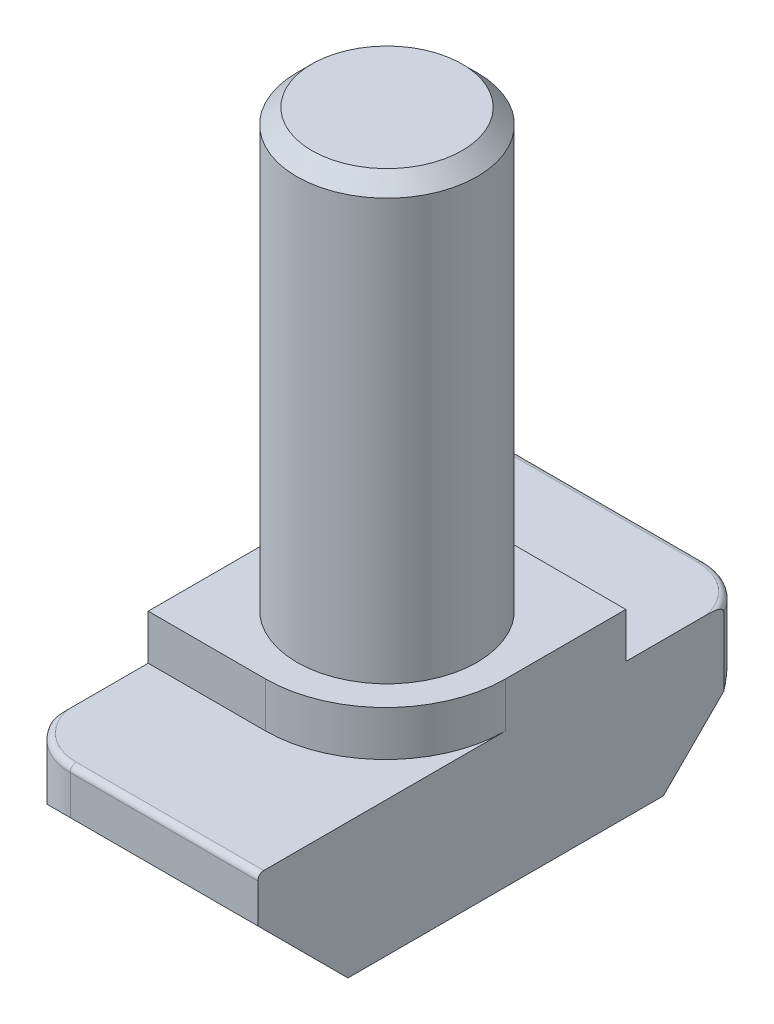
ISO-10303-21;
HEADER;
FILE_DESCRIPTION(('STEP AP214'),'2;1');
FILE_NAME('part.step','',(''),(''),'','','');
FILE_SCHEMA(('AUTOMOTIVE_DESIGN { 1 0 10303 214 1 1 1 1 }'));
ENDSEC;
DATA;
#1=APPLICATION_CONTEXT('core data for automotive mechanical design processes');
#2=APPLICATION_PROTOCOL_DEFINITION('international standard','automotive_design',2000,#1);
#3=PRODUCT_CONTEXT('',#1,'mechanical');
#4=PRODUCT('Part','Part','',(#3));
#5=PRODUCT_RELATED_PRODUCT_CATEGORY('part','',(#4));
#6=PRODUCT_DEFINITION_FORMATION('','',#4);
#7=PRODUCT_DEFINITION_CONTEXT('part definition',#1,'design');
#8=PRODUCT_DEFINITION('design','',#6,#7);
#9=PRODUCT_DEFINITION_SHAPE('','',#8);
#10=(LENGTH_UNIT() NAMED_UNIT(*) SI_UNIT(.MILLI.,.METRE.));
#11=(NAMED_UNIT(*) PLANE_ANGLE_UNIT() SI_UNIT($,.RADIAN.));
#12=(NAMED_UNIT(*) SI_UNIT($,.STERADIAN.) SOLID_ANGLE_UNIT());
#13=UNCERTAINTY_MEASURE_WITH_UNIT(LENGTH_MEASURE(1.E-05),#10,'distance_accuracy_value','');
#14=(GEOMETRIC_REPRESENTATION_CONTEXT(3) GLOBAL_UNCERTAINTY_ASSIGNED_CONTEXT((#13)) GLOBAL_UNIT_ASSIGNED_CONTEXT((#10,
#11,#12)) REPRESENTATION_CONTEXT('',''));
#15=CARTESIAN_POINT('',(0.,0.,0.));
#16=DIRECTION('',(0.,0.,1.));
#17=DIRECTION('',(1.,0.,0.));
#18=AXIS2_PLACEMENT_3D('',#15,#16,#17);
#19=CARTESIAN_POINT('',(-3.95,-1.5,-4.));
#20=DIRECTION('',(0.,0.,-1.));
#21=DIRECTION('',(-1.,0.,0.));
#22=AXIS2_PLACEMENT_3D('',#19,#20,#21);
#23=PLANE('',#22);
#24=DIRECTION('',(0.,1.,0.));
#25=VECTOR('',#24,1.);
#26=CARTESIAN_POINT('',(3.95,-1.5,-4.));
#27=LINE('',#26,#25);
#28=CARTESIAN_POINT('',(3.95,0.,-4.));
#29=VERTEX_POINT('',#28);
#30=CARTESIAN_POINT('',(3.95,-1.5,-4.));
#31=VERTEX_POINT('',#30);
#32=EDGE_CURVE('E330',#29,#31,#27,.F.);
#33=ORIENTED_EDGE('',*,*,#32,.T.);
#34=DIRECTION('',(1.,0.,0.));
#35=VECTOR('',#34,1.);
#36=CARTESIAN_POINT('',(-3.95,-1.5,-4.));
#37=LINE('',#36,#35);
#38=CARTESIAN_POINT('',(0.0500000000000003,-1.5,-4.));
#39=VERTEX_POINT('',#38);
#40=EDGE_CURVE('E332',#39,#31,#37,.T.);
#41=ORIENTED_EDGE('',*,*,#40,.F.);
#42=DIRECTION('',(0.,1.,0.));
#43=VECTOR('',#42,1.);
#44=CARTESIAN_POINT('',(0.0500000000000005,0.,-4.));
#45=LINE('',#44,#43);
#46=CARTESIAN_POINT('',(0.0500000000000003,0.,-4.));
#47=VERTEX_POINT('',#46);
#48=EDGE_CURVE('E337',#47,#39,#45,.F.);
#49=ORIENTED_EDGE('',*,*,#48,.F.);
#50=DIRECTION('',(1.,0.,0.));
#51=VECTOR('',#50,1.);
#52=CARTESIAN_POINT('',(-3.95,0.,-4.));
#53=LINE('',#52,#51);
#54=EDGE_CURVE('E335',#29,#47,#53,.F.);
#55=ORIENTED_EDGE('',*,*,#54,.F.);
#56=EDGE_LOOP('',(#33,#41,#49,#55));
#57=FACE_BOUND('',#56,.T.);
#58=ADVANCED_FACE('F36',(#57),#23,.T.);
#59=CARTESIAN_POINT('',(0.05,0.,0.));
#60=DIRECTION('',(0.,1.,0.));
#61=DIRECTION('',(0.,0.,1.));
#62=AXIS2_PLACEMENT_3D('',#59,#60,#61);
#63=CYLINDRICAL_SURFACE('',#62,4.);
#64=CARTESIAN_POINT('',(0.05,-1.5,0.));
#65=DIRECTION('',(0.,1.,0.));
#66=DIRECTION('',(0.,0.,1.));
#67=AXIS2_PLACEMENT_3D('',#64,#65,#66);
#68=CIRCLE('',#67,4.);
#69=CARTESIAN_POINT('',(-3.95,-1.5,0.));
#70=VERTEX_POINT('',#69);
#71=EDGE_CURVE('E343',#70,#39,#68,.F.);
#72=ORIENTED_EDGE('',*,*,#71,.F.);
#73=DIRECTION('',(0.,1.,0.));
#74=VECTOR('',#73,1.);
#75=CARTESIAN_POINT('',(-3.95,0.,0.));
#76=LINE('',#75,#74);
#77=CARTESIAN_POINT('',(-3.95,0.,0.));
#78=VERTEX_POINT('',#77);
#79=EDGE_CURVE('E398',#70,#78,#76,.T.);
#80=ORIENTED_EDGE('',*,*,#79,.T.);
#81=CARTESIAN_POINT('',(0.05,0.,0.));
#82=DIRECTION('',(0.,1.,0.));
#83=DIRECTION('',(0.,0.,1.));
#84=AXIS2_PLACEMENT_3D('',#81,#82,#83);
#85=CIRCLE('',#84,4.);
#86=EDGE_CURVE('E385',#47,#78,#85,.T.);
#87=ORIENTED_EDGE('',*,*,#86,.F.);
#88=ORIENTED_EDGE('',*,*,#48,.T.);
#89=EDGE_LOOP('',(#72,#80,#87,#88));
#90=FACE_BOUND('',#89,.T.);
#91=ADVANCED_FACE('F318',(#90),#63,.T.);
#92=CARTESIAN_POINT('',(-0.05,0.,0.));
#93=DIRECTION('',(0.,1.,0.));
#94=DIRECTION('',(0.,0.,1.));
#95=AXIS2_PLACEMENT_3D('',#92,#93,#94);
#96=CYLINDRICAL_SURFACE('',#95,4.);
#97=CARTESIAN_POINT('',(-0.05,-1.5,0.));
#98=DIRECTION('',(0.,1.,0.));
#99=DIRECTION('',(0.,0.,1.));
#100=AXIS2_PLACEMENT_3D('',#97,#98,#99);
#101=CIRCLE('',#100,4.);
#102=CARTESIAN_POINT('',(3.95,-1.5,0.));
#103=VERTEX_POINT('',#102);
#104=CARTESIAN_POINT('',(-0.0500000000000001,-1.5,4.));
#105=VERTEX_POINT('',#104);
#106=EDGE_CURVE('E388',#103,#105,#101,.F.);
#107=ORIENTED_EDGE('',*,*,#106,.F.);
#108=DIRECTION('',(0.,1.,0.));
#109=VECTOR('',#108,1.);
#110=CARTESIAN_POINT('',(3.95,0.,0.));
#111=LINE('',#110,#109);
#112=CARTESIAN_POINT('',(3.95,0.,0.));
#113=VERTEX_POINT('',#112);
#114=EDGE_CURVE('E405',#103,#113,#111,.T.);
#115=ORIENTED_EDGE('',*,*,#114,.T.);
#116=CARTESIAN_POINT('',(-0.05,0.,0.));
#117=DIRECTION('',(0.,1.,0.));
#118=DIRECTION('',(0.,0.,1.));
#119=AXIS2_PLACEMENT_3D('',#116,#117,#118);
#120=CIRCLE('',#119,4.);
#121=CARTESIAN_POINT('',(-0.0500000000000001,0.,4.));
#122=VERTEX_POINT('',#121);
#123=EDGE_CURVE('E382',#122,#113,#120,.T.);
#124=ORIENTED_EDGE('',*,*,#123,.F.);
#125=DIRECTION('',(0.,1.,0.));
#126=VECTOR('',#125,1.);
#127=CARTESIAN_POINT('',(-0.0500000000000001,0.,4.));
#128=LINE('',#127,#126);
#129=EDGE_CURVE('E407',#105,#122,#128,.T.);
#130=ORIENTED_EDGE('',*,*,#129,.F.);
#131=EDGE_LOOP('',(#107,#115,#124,#130));
#132=FACE_BOUND('',#131,.T.);
#133=ADVANCED_FACE('F314',(#132),#96,.T.);
#134=CARTESIAN_POINT('',(-3.95,0.,4.));
#135=DIRECTION('',(0.,0.,1.));
#136=DIRECTION('',(1.,0.,0.));
#137=AXIS2_PLACEMENT_3D('',#134,#135,#136);
#138=PLANE('',#137);
#139=ORIENTED_EDGE('',*,*,#129,.T.);
#140=DIRECTION('',(1.,0.,0.));
#141=VECTOR('',#140,1.);
#142=CARTESIAN_POINT('',(-3.95,0.,4.));
#143=LINE('',#142,#141);
#144=CARTESIAN_POINT('',(-3.95,0.,4.));
#145=VERTEX_POINT('',#144);
#146=EDGE_CURVE('E347',#145,#122,#143,.T.);
#147=ORIENTED_EDGE('',*,*,#146,.F.);
#148=DIRECTION('',(0.,1.,0.));
#149=VECTOR('',#148,1.);
#150=CARTESIAN_POINT('',(-3.95,0.,4.));
#151=LINE('',#150,#149);
#152=CARTESIAN_POINT('',(-3.95,-1.5,4.));
#153=VERTEX_POINT('',#152);
#154=EDGE_CURVE('E400',#145,#153,#151,.F.);
#155=ORIENTED_EDGE('',*,*,#154,.T.);
#156=DIRECTION('',(1.,0.,0.));
#157=VECTOR('',#156,1.);
#158=CARTESIAN_POINT('',(-3.95,-1.5,4.));
#159=LINE('',#158,#157);
#160=EDGE_CURVE('E391',#105,#153,#159,.F.);
#161=ORIENTED_EDGE('',*,*,#160,.F.);
#162=EDGE_LOOP('',(#139,#147,#155,#161));
#163=FACE_BOUND('',#162,.T.);
#164=ADVANCED_FACE('F310',(#163),#138,.T.);
#165=CARTESIAN_POINT('',(-3.95,-1.5,8.25));
#166=DIRECTION('',(0.,0.,1.));
#167=DIRECTION('',(1.,0.,0.));
#168=AXIS2_PLACEMENT_3D('',#165,#166,#167);
#169=PLANE('',#168);
#170=DIRECTION('',(0.,1.,0.));
#171=VECTOR('',#170,1.);
#172=CARTESIAN_POINT('',(3.95,-1.5,8.25));
#173=LINE('',#172,#171);
#174=CARTESIAN_POINT('',(3.95,-3.,8.25));
#175=VERTEX_POINT('',#174);
#176=CARTESIAN_POINT('',(3.95,-1.7,8.25));
#177=VERTEX_POINT('',#176);
#178=EDGE_CURVE('E409',#175,#177,#173,.T.);
#179=ORIENTED_EDGE('',*,*,#178,.T.);
#180=DIRECTION('',(1.,0.,0.));
#181=VECTOR('',#180,1.);
#182=CARTESIAN_POINT('',(-3.95,-1.7,8.25));
#183=LINE('',#182,#181);
#184=CARTESIAN_POINT('',(-2.293413147463,-1.7,8.25));
#185=VERTEX_POINT('',#184);
#186=EDGE_CURVE('E45',#177,#185,#183,.F.);
#187=ORIENTED_EDGE('',*,*,#186,.T.);
#188=DIRECTION('',(0.,1.,0.));
#189=VECTOR('',#188,1.);
#190=CARTESIAN_POINT('',(-2.293413147463,-1.5,8.25));
#191=LINE('',#190,#189);
#192=CARTESIAN_POINT('',(-2.293413147463,-3.,8.25));
#193=VERTEX_POINT('',#192);
#194=EDGE_CURVE('E401',#193,#185,#191,.T.);
#195=ORIENTED_EDGE('',*,*,#194,.F.);
#196=DIRECTION('',(1.,0.,0.));
#197=VECTOR('',#196,1.);
#198=CARTESIAN_POINT('',(-3.95,-3.,8.25));
#199=LINE('',#198,#197);
#200=EDGE_CURVE('E395',#175,#193,#199,.F.);
#201=ORIENTED_EDGE('',*,*,#200,.F.);
#202=EDGE_LOOP('',(#179,#187,#195,#201));
#203=FACE_BOUND('',#202,.T.);
#204=ADVANCED_FACE('F306',(#203),#169,.T.);
#205=CARTESIAN_POINT('',(-2.293413147463,-1.5,6.369));
#206=DIRECTION('',(0.,1.,0.));
#207=DIRECTION('',(0.,0.,1.));
#208=AXIS2_PLACEMENT_3D('',#205,#206,#207);
#209=CYLINDRICAL_SURFACE('',#208,1.881);
#210=ORIENTED_EDGE('',*,*,#194,.T.);
#211=CARTESIAN_POINT('',(-2.293413147463,-1.7,6.369));
#212=DIRECTION('',(0.,1.,0.));
#213=DIRECTION('',(0.,0.,1.));
#214=AXIS2_PLACEMENT_3D('',#211,#212,#213);
#215=CIRCLE('',#214,1.881);
#216=CARTESIAN_POINT('',(-3.95,-1.7,7.26));
#217=VERTEX_POINT('',#216);
#218=EDGE_CURVE('E362',#185,#217,#215,.F.);
#219=ORIENTED_EDGE('',*,*,#218,.T.);
#220=DIRECTION('',(0.,1.,0.));
#221=VECTOR('',#220,1.);
#222=CARTESIAN_POINT('',(-3.95,0.,7.26));
#223=LINE('',#222,#221);
#224=CARTESIAN_POINT('',(-3.95,-3.98999999999956,7.26000000000044));
#225=VERTEX_POINT('',#224);
#226=EDGE_CURVE('E413',#217,#225,#223,.F.);
#227=ORIENTED_EDGE('',*,*,#226,.T.);
#228=CARTESIAN_POINT('',(-2.293413147463,-4.881,6.369));
#229=DIRECTION('',(0.,-0.707106781186548,0.707106781186548));
#230=DIRECTION('',(0.,0.707106781186548,0.707106781186548));
#231=AXIS2_PLACEMENT_3D('',#228,#229,#230);
#232=ELLIPSE('',#231,2.66013571082379,1.881);
#233=EDGE_CURVE('E392',#193,#225,#232,.T.);
#234=ORIENTED_EDGE('',*,*,#233,.F.);
#235=EDGE_LOOP('',(#210,#219,#227,#234));
#236=FACE_BOUND('',#235,.T.);
#237=ADVANCED_FACE('F302',(#236),#209,.T.);
#238=CARTESIAN_POINT('',(-3.95,0.,0.));
#239=DIRECTION('',(1.,0.,0.));
#240=DIRECTION('',(0.,0.,-1.));
#241=AXIS2_PLACEMENT_3D('',#238,#239,#240);
#242=PLANE('',#241);
#243=ORIENTED_EDGE('',*,*,#226,.F.);
#244=CARTESIAN_POINT('',(-3.95000000000036,-1.7,7.2600000000002));
#245=CARTESIAN_POINT('',(-3.95000000000013,-1.69427735811856,7.26001404861626));
#246=CARTESIAN_POINT('',(-3.95000000000004,-1.68857029666396,7.25948232376858));
#247=CARTESIAN_POINT('',(-3.94999999999997,-1.67738203946633,7.25745099717976));
#248=CARTESIAN_POINT('',(-3.94999999999999,-1.67189926589036,7.25596020761613));
#249=CARTESIAN_POINT('',(-3.95000000000001,-1.66126183384623,7.25213637092842));
#250=CARTESIAN_POINT('',(-3.95,-1.65610621745709,7.24980593018562));
#251=CARTESIAN_POINT('',(-3.95,-1.64615813695309,7.24445417506465));
#252=CARTESIAN_POINT('',(-3.95,-1.64136658436695,7.2414311980311));
#253=CARTESIAN_POINT('',(-3.95,-1.62893790284732,7.23251768546538));
#254=CARTESIAN_POINT('',(-3.95,-1.6216741638194,7.22610730324774));
#255=CARTESIAN_POINT('',(-3.95,-1.60821225523846,7.21225580372375));
#256=CARTESIAN_POINT('',(-3.95,-1.60201715169264,7.20481182772303));
#257=CARTESIAN_POINT('',(-3.95,-1.58603735713632,7.18314183721125));
#258=CARTESIAN_POINT('',(-3.95,-1.57725679557126,7.16818258706336));
#259=CARTESIAN_POINT('',(-3.95,-1.56186571276097,7.13721157539828));
#260=CARTESIAN_POINT('',(-3.95,-1.55526057035327,7.12119732080324));
#261=CARTESIAN_POINT('',(-3.95,-1.54119695425057,7.08160771900923));
#262=CARTESIAN_POINT('',(-3.95,-1.53458770750697,7.0577355434191));
#263=CARTESIAN_POINT('',(-3.95,-1.52365853653203,7.00945825554998));
#264=CARTESIAN_POINT('',(-3.95,-1.51934381961001,6.98505206082167));
#265=CARTESIAN_POINT('',(-3.95,-1.51233851474669,6.93588560582769));
#266=CARTESIAN_POINT('',(-3.95,-1.5096565786231,6.91112415904987));
#267=CARTESIAN_POINT('',(-3.95,-1.5054699129572,6.86149970282827));
#268=CARTESIAN_POINT('',(-3.95,-1.50396564592826,6.83663665733255));
#269=CARTESIAN_POINT('',(-3.95,-1.50170056075098,6.78541029123998));
#270=CARTESIAN_POINT('',(-3.95,-1.50098886594518,6.75904503927643));
#271=CARTESIAN_POINT('',(-3.95,-1.50014794032461,6.70660033620937));
#272=CARTESIAN_POINT('',(-3.95,-1.50001225654755,6.68052100145076));
#273=CARTESIAN_POINT('',(-3.95,-1.5,6.65444876948685));
#274=B_SPLINE_CURVE_WITH_KNOTS('',3,(#244,#245,#246,#247,#248,#249,#250,#251,#252,#253,#254,
#255,#256,#257,#258,#259,#260,#261,#262,#263,#264,#265,#266,#267,#268,#269,#270,#271,#272,#273),
.UNSPECIFIED.,.F.,.F.,(4,2,2,2,2,2,2,2,2,2,2,2,2,2,4),(0.,0.0171185141200355,0.0340819420852393,
0.0509931608298935,0.067945413948047,0.0968403291416045,0.125816815135882,0.177560499514281,
0.229431178816894,0.303551028790914,0.377838379496405,0.452516015401698,0.527222965231822,
0.60633953173482,0.684567389370482),.UNSPECIFIED.);
#275=CARTESIAN_POINT('',(-3.95,-1.5,6.65444876948685));
#276=VERTEX_POINT('',#275);
#277=EDGE_CURVE('E216',#217,#276,#274,.T.);
#278=ORIENTED_EDGE('',*,*,#277,.T.);
#279=DIRECTION('',(0.,0.,1.));
#280=VECTOR('',#279,1.);
#281=CARTESIAN_POINT('',(-3.95,-1.5,4.));
#282=LINE('',#281,#280);
#283=EDGE_CURVE('E459',#153,#276,#282,.T.);
#284=ORIENTED_EDGE('',*,*,#283,.F.);
#285=ORIENTED_EDGE('',*,*,#154,.F.);
#286=DIRECTION('',(0.,0.,1.));
#287=VECTOR('',#286,1.);
#288=CARTESIAN_POINT('',(-3.95,0.,-4.));
#289=LINE('',#288,#287);
#290=EDGE_CURVE('E344',#78,#145,#289,.T.);
#291=ORIENTED_EDGE('',*,*,#290,.F.);
#292=ORIENTED_EDGE('',*,*,#79,.F.);
#293=DIRECTION('',(0.,0.,1.));
#294=VECTOR('',#293,1.);
#295=CARTESIAN_POINT('',(-3.95,-1.5,4.));
#296=LINE('',#295,#294);
#297=CARTESIAN_POINT('',(-3.95,-1.5,-8.05));
#298=VERTEX_POINT('',#297);
#299=EDGE_CURVE('E349',#298,#70,#296,.T.);
#300=ORIENTED_EDGE('',*,*,#299,.F.);
#301=CARTESIAN_POINT('',(-3.95,-1.7,-8.05));
#302=DIRECTION('',(1.,0.,0.));
#303=DIRECTION('',(0.,0.,-1.));
#304=AXIS2_PLACEMENT_3D('',#301,#302,#303);
#305=CIRCLE('',#304,0.2);
#306=CARTESIAN_POINT('',(-3.95,-1.7,-8.25));
#307=VERTEX_POINT('',#306);
#308=EDGE_CURVE('E364',#298,#307,#305,.F.);
#309=ORIENTED_EDGE('',*,*,#308,.T.);
#310=DIRECTION('',(0.,1.,0.));
#311=VECTOR('',#310,1.);
#312=CARTESIAN_POINT('',(-3.95,-3.,-8.25));
#313=LINE('',#312,#311);
#314=CARTESIAN_POINT('',(-3.95,-3.,-8.25));
#315=VERTEX_POINT('',#314);
#316=EDGE_CURVE('E210',#315,#307,#313,.T.);
#317=ORIENTED_EDGE('',*,*,#316,.F.);
#318=DIRECTION('',(0.,0.707106781186548,-0.707106781186548));
#319=VECTOR('',#318,1.);
#320=CARTESIAN_POINT('',(-3.95,-6.,-5.25));
#321=LINE('',#320,#319);
#322=CARTESIAN_POINT('',(-3.95,-6.,-5.25));
#323=VERTEX_POINT('',#322);
#324=EDGE_CURVE('E169',#323,#315,#321,.T.);
#325=ORIENTED_EDGE('',*,*,#324,.F.);
#326=DIRECTION('',(0.,0.,-1.));
#327=VECTOR('',#326,1.);
#328=CARTESIAN_POINT('',(-3.95,-6.,5.25));
#329=LINE('',#328,#327);
#330=CARTESIAN_POINT('',(-3.95,-6.,5.25));
#331=VERTEX_POINT('',#330);
#332=EDGE_CURVE('E165',#331,#323,#329,.T.);
#333=ORIENTED_EDGE('',*,*,#332,.F.);
#334=DIRECTION('',(0.,-0.707106781186548,-0.707106781186548));
#335=VECTOR('',#334,1.);
#336=CARTESIAN_POINT('',(-3.95,-3.,8.25));
#337=LINE('',#336,#335);
#338=EDGE_CURVE('E194',#225,#331,#337,.T.);
#339=ORIENTED_EDGE('',*,*,#338,.F.);
#340=EDGE_LOOP('',(#243,#278,#284,#285,#291,#292,#300,#309,#317,#325,#333,#339));
#341=FACE_BOUND('',#340,.T.);
#342=ADVANCED_FACE('F298',(#341),#242,.F.);
#343=CARTESIAN_POINT('',(-3.95,-3.,-8.25));
#344=DIRECTION('',(0.,0.,-1.));
#345=DIRECTION('',(-1.,0.,0.));
#346=AXIS2_PLACEMENT_3D('',#343,#344,#345);
#347=PLANE('',#346);
#348=ORIENTED_EDGE('',*,*,#316,.T.);
#349=DIRECTION('',(-1.,0.,0.));
#350=VECTOR('',#349,1.);
#351=CARTESIAN_POINT('',(-3.95,-1.7,-8.25));
#352=LINE('',#351,#350);
#353=CARTESIAN_POINT('',(2.293413147463,-1.7,-8.25));
#354=VERTEX_POINT('',#353);
#355=EDGE_CURVE('E12',#307,#354,#352,.F.);
#356=ORIENTED_EDGE('',*,*,#355,.T.);
#357=DIRECTION('',(0.,1.,0.));
#358=VECTOR('',#357,1.);
#359=CARTESIAN_POINT('',(2.293413147463,-1.5,-8.25));
#360=LINE('',#359,#358);
#361=CARTESIAN_POINT('',(2.293413147463,-3.,-8.25));
#362=VERTEX_POINT('',#361);
#363=EDGE_CURVE('E353',#362,#354,#360,.T.);
#364=ORIENTED_EDGE('',*,*,#363,.F.);
#365=DIRECTION('',(1.,0.,0.));
#366=VECTOR('',#365,1.);
#367=CARTESIAN_POINT('',(-3.95,-3.,-8.25));
#368=LINE('',#367,#366);
#369=EDGE_CURVE('E397',#315,#362,#368,.T.);
#370=ORIENTED_EDGE('',*,*,#369,.F.);
#371=EDGE_LOOP('',(#348,#356,#364,#370));
#372=FACE_BOUND('',#371,.T.);
#373=ADVANCED_FACE('F295',(#372),#347,.T.);
#374=CARTESIAN_POINT('',(2.293413147463,-1.5,-6.369));
#375=DIRECTION('',(0.,1.,0.));
#376=DIRECTION('',(0.,0.,1.));
#377=AXIS2_PLACEMENT_3D('',#374,#375,#376);
#378=CYLINDRICAL_SURFACE('',#377,1.881);
#379=ORIENTED_EDGE('',*,*,#363,.T.);
#380=CARTESIAN_POINT('',(2.293413147463,-1.7,-6.369));
#381=DIRECTION('',(0.,1.,0.));
#382=DIRECTION('',(0.,0.,1.));
#383=AXIS2_PLACEMENT_3D('',#380,#381,#382);
#384=CIRCLE('',#383,1.881);
#385=CARTESIAN_POINT('',(3.95,-1.7,-7.26));
#386=VERTEX_POINT('',#385);
#387=EDGE_CURVE('E228',#354,#386,#384,.F.);
#388=ORIENTED_EDGE('',*,*,#387,.T.);
#389=DIRECTION('',(0.,1.,0.));
#390=VECTOR('',#389,1.);
#391=CARTESIAN_POINT('',(3.95,0.,-7.26));
#392=LINE('',#391,#390);
#393=CARTESIAN_POINT('',(3.95,-3.98999999999957,-7.26000000000043));
#394=VERTEX_POINT('',#393);
#395=EDGE_CURVE('E215',#394,#386,#392,.T.);
#396=ORIENTED_EDGE('',*,*,#395,.F.);
#397=CARTESIAN_POINT('',(2.293413147463,-4.881,-6.369));
#398=DIRECTION('',(0.,-0.707106781186548,-0.707106781186548));
#399=DIRECTION('',(0.,0.707106781186548,-0.707106781186548));
#400=AXIS2_PLACEMENT_3D('',#397,#398,#399);
#401=ELLIPSE('',#400,2.66013571082379,1.881);
#402=EDGE_CURVE('E177',#362,#394,#401,.T.);
#403=ORIENTED_EDGE('',*,*,#402,.F.);
#404=EDGE_LOOP('',(#379,#388,#396,#403));
#405=FACE_BOUND('',#404,.T.);
#406=ADVANCED_FACE('F291',(#405),#378,.T.);
#407=CARTESIAN_POINT('',(-3.95,-1.5,4.));
#408=DIRECTION('',(0.,1.,0.));
#409=DIRECTION('',(0.,0.,1.));
#410=AXIS2_PLACEMENT_3D('',#407,#408,#409);
#411=PLANE('',#410);
#412=DIRECTION('',(0.,0.,-1.));
#413=VECTOR('',#412,1.);
#414=CARTESIAN_POINT('',(3.95,-1.5,0.));
#415=LINE('',#414,#413);
#416=CARTESIAN_POINT('',(3.95,-1.5,-6.65444876948685));
#417=VERTEX_POINT('',#416);
#418=EDGE_CURVE('E205',#417,#31,#415,.F.);
#419=ORIENTED_EDGE('',*,*,#418,.F.);
#420=CARTESIAN_POINT('',(2.293413147463,-1.5,-6.369));
#421=DIRECTION('',(0.,1.,0.));
#422=DIRECTION('',(0.,0.,1.));
#423=AXIS2_PLACEMENT_3D('',#420,#421,#422);
#424=CIRCLE('',#423,1.681);
#425=CARTESIAN_POINT('',(2.293413147463,-1.5,-8.05));
#426=VERTEX_POINT('',#425);
#427=EDGE_CURVE('E225',#417,#426,#424,.T.);
#428=ORIENTED_EDGE('',*,*,#427,.T.);
#429=DIRECTION('',(-1.,0.,0.));
#430=VECTOR('',#429,1.);
#431=CARTESIAN_POINT('',(-3.95,-1.5,-8.05));
#432=LINE('',#431,#430);
#433=EDGE_CURVE('E223',#426,#298,#432,.T.);
#434=ORIENTED_EDGE('',*,*,#433,.T.);
#435=ORIENTED_EDGE('',*,*,#299,.T.);
#436=ORIENTED_EDGE('',*,*,#71,.T.);
#437=ORIENTED_EDGE('',*,*,#40,.T.);
#438=EDGE_LOOP('',(#419,#428,#434,#435,#436,#437));
#439=FACE_BOUND('',#438,.T.);
#440=ADVANCED_FACE('F287',(#439),#411,.T.);
#441=CARTESIAN_POINT('',(-3.95,0.,-4.));
#442=DIRECTION('',(0.,1.,0.));
#443=DIRECTION('',(0.,0.,1.));
#444=AXIS2_PLACEMENT_3D('',#441,#442,#443);
#445=PLANE('',#444);
#446=CARTESIAN_POINT('',(0.,0.,0.));
#447=DIRECTION('',(0.,1.,0.));
#448=DIRECTION('',(0.,0.,1.));
#449=AXIS2_PLACEMENT_3D('',#446,#447,#448);
#450=CIRCLE('',#449,3.);
#451=CARTESIAN_POINT('',(0.,0.,3.));
#452=VERTEX_POINT('',#451);
#453=EDGE_CURVE('E338',#452,#452,#450,.T.);
#454=ORIENTED_EDGE('',*,*,#453,.F.);
#455=EDGE_LOOP('',(#454));
#456=FACE_BOUND('',#455,.T.);
#457=ORIENTED_EDGE('',*,*,#54,.T.);
#458=ORIENTED_EDGE('',*,*,#86,.T.);
#459=ORIENTED_EDGE('',*,*,#290,.T.);
#460=ORIENTED_EDGE('',*,*,#146,.T.);
#461=ORIENTED_EDGE('',*,*,#123,.T.);
#462=DIRECTION('',(0.,0.,-1.));
#463=VECTOR('',#462,1.);
#464=CARTESIAN_POINT('',(3.95,0.,0.));
#465=LINE('',#464,#463);
#466=EDGE_CURVE('E200',#29,#113,#465,.F.);
#467=ORIENTED_EDGE('',*,*,#466,.F.);
#468=EDGE_LOOP('',(#457,#458,#459,#460,#461,#467));
#469=FACE_BOUND('',#468,.T.);
#470=ADVANCED_FACE('F283',(#456,#469),#445,.T.);
#471=CARTESIAN_POINT('',(-3.95,-1.5,4.));
#472=DIRECTION('',(0.,1.,0.));
#473=DIRECTION('',(0.,0.,1.));
#474=AXIS2_PLACEMENT_3D('',#471,#472,#473);
#475=PLANE('',#474);
#476=ORIENTED_EDGE('',*,*,#283,.T.);
#477=CARTESIAN_POINT('',(-2.293413147463,-1.5,6.369));
#478=DIRECTION('',(0.,1.,0.));
#479=DIRECTION('',(0.,0.,1.));
#480=AXIS2_PLACEMENT_3D('',#477,#478,#479);
#481=CIRCLE('',#480,1.681);
#482=CARTESIAN_POINT('',(-2.293413147463,-1.5,8.05));
#483=VERTEX_POINT('',#482);
#484=EDGE_CURVE('E367',#276,#483,#481,.T.);
#485=ORIENTED_EDGE('',*,*,#484,.T.);
#486=DIRECTION('',(1.,0.,0.));
#487=VECTOR('',#486,1.);
#488=CARTESIAN_POINT('',(-3.95,-1.5,8.05));
#489=LINE('',#488,#487);
#490=CARTESIAN_POINT('',(3.95,-1.5,8.05));
#491=VERTEX_POINT('',#490);
#492=EDGE_CURVE('E372',#483,#491,#489,.T.);
#493=ORIENTED_EDGE('',*,*,#492,.T.);
#494=DIRECTION('',(0.,0.,-1.));
#495=VECTOR('',#494,1.);
#496=CARTESIAN_POINT('',(3.95,-1.5,0.));
#497=LINE('',#496,#495);
#498=EDGE_CURVE('E185',#103,#491,#497,.F.);
#499=ORIENTED_EDGE('',*,*,#498,.F.);
#500=ORIENTED_EDGE('',*,*,#106,.T.);
#501=ORIENTED_EDGE('',*,*,#160,.T.);
#502=EDGE_LOOP('',(#476,#485,#493,#499,#500,#501));
#503=FACE_BOUND('',#502,.T.);
#504=ADVANCED_FACE('F279',(#503),#475,.T.);
#505=CARTESIAN_POINT('',(-3.95,-3.,8.25));
#506=DIRECTION('',(0.,-0.707106781186548,0.707106781186548));
#507=DIRECTION('',(0.,-0.707106781186548,-0.707106781186548));
#508=AXIS2_PLACEMENT_3D('',#505,#506,#507);
#509=PLANE('',#508);
#510=ORIENTED_EDGE('',*,*,#233,.T.);
#511=ORIENTED_EDGE('',*,*,#338,.T.);
#512=DIRECTION('',(1.,0.,0.));
#513=VECTOR('',#512,1.);
#514=CARTESIAN_POINT('',(-3.95,-6.,5.25));
#515=LINE('',#514,#513);
#516=CARTESIAN_POINT('',(3.95,-6.,5.25));
#517=VERTEX_POINT('',#516);
#518=EDGE_CURVE('E192',#517,#331,#515,.F.);
#519=ORIENTED_EDGE('',*,*,#518,.F.);
#520=DIRECTION('',(0.,-0.707106781186548,-0.707106781186548));
#521=VECTOR('',#520,1.);
#522=CARTESIAN_POINT('',(3.95,-3.,8.25));
#523=LINE('',#522,#521);
#524=EDGE_CURVE('E183',#175,#517,#523,.T.);
#525=ORIENTED_EDGE('',*,*,#524,.F.);
#526=ORIENTED_EDGE('',*,*,#200,.T.);
#527=EDGE_LOOP('',(#510,#511,#519,#525,#526));
#528=FACE_BOUND('',#527,.T.);
#529=ADVANCED_FACE('F274',(#528),#509,.T.);
#530=CARTESIAN_POINT('',(-3.95,-6.,5.25));
#531=DIRECTION('',(0.,-1.,0.));
#532=DIRECTION('',(0.,0.,-1.));
#533=AXIS2_PLACEMENT_3D('',#530,#531,#532);
#534=PLANE('',#533);
#535=ORIENTED_EDGE('',*,*,#518,.T.);
#536=ORIENTED_EDGE('',*,*,#332,.T.);
#537=DIRECTION('',(1.,0.,0.));
#538=VECTOR('',#537,1.);
#539=CARTESIAN_POINT('',(-3.95,-6.,-5.25));
#540=LINE('',#539,#538);
#541=CARTESIAN_POINT('',(3.95,-6.,-5.25));
#542=VERTEX_POINT('',#541);
#543=EDGE_CURVE('E157',#542,#323,#540,.F.);
#544=ORIENTED_EDGE('',*,*,#543,.F.);
#545=DIRECTION('',(0.,0.,-1.));
#546=VECTOR('',#545,1.);
#547=CARTESIAN_POINT('',(3.95,-6.,0.));
#548=LINE('',#547,#546);
#549=EDGE_CURVE('E162',#517,#542,#548,.T.);
#550=ORIENTED_EDGE('',*,*,#549,.F.);
#551=EDGE_LOOP('',(#535,#536,#544,#550));
#552=FACE_BOUND('',#551,.T.);
#553=ADVANCED_FACE('F160',(#552),#534,.T.);
#554=CARTESIAN_POINT('',(-3.95,-6.,-5.25));
#555=DIRECTION('',(0.,-0.707106781186548,-0.707106781186548));
#556=DIRECTION('',(0.,0.707106781186548,-0.707106781186548));
#557=AXIS2_PLACEMENT_3D('',#554,#555,#556);
#558=PLANE('',#557);
#559=ORIENTED_EDGE('',*,*,#402,.T.);
#560=DIRECTION('',(0.,0.707106781186547,-0.707106781186547));
#561=VECTOR('',#560,1.);
#562=CARTESIAN_POINT('',(3.95,-6.,-5.25));
#563=LINE('',#562,#561);
#564=EDGE_CURVE('E173',#542,#394,#563,.T.);
#565=ORIENTED_EDGE('',*,*,#564,.F.);
#566=ORIENTED_EDGE('',*,*,#543,.T.);
#567=ORIENTED_EDGE('',*,*,#324,.T.);
#568=ORIENTED_EDGE('',*,*,#369,.T.);
#569=EDGE_LOOP('',(#559,#565,#566,#567,#568));
#570=FACE_BOUND('',#569,.T.);
#571=ADVANCED_FACE('F174',(#570),#558,.T.);
#572=CARTESIAN_POINT('',(3.95,0.,0.));
#573=DIRECTION('',(1.,0.,0.));
#574=DIRECTION('',(0.,0.,-1.));
#575=AXIS2_PLACEMENT_3D('',#572,#573,#574);
#576=PLANE('',#575);
#577=ORIENTED_EDGE('',*,*,#395,.T.);
#578=CARTESIAN_POINT('',(3.95000000000036,-1.7,-7.2600000000002));
#579=CARTESIAN_POINT('',(3.95000000000013,-1.69427735811856,-7.26001404861626));
#580=CARTESIAN_POINT('',(3.95000000000004,-1.68857029666396,-7.25948232376858));
#581=CARTESIAN_POINT('',(3.94999999999997,-1.67738203946633,-7.25745099717976));
#582=CARTESIAN_POINT('',(3.94999999999999,-1.67189926589036,-7.25596020761613));
#583=CARTESIAN_POINT('',(3.95000000000001,-1.66126183384623,-7.25213637092842));
#584=CARTESIAN_POINT('',(3.95,-1.65610621745709,-7.24980593018562));
#585=CARTESIAN_POINT('',(3.95,-1.64615813695309,-7.24445417506465));
#586=CARTESIAN_POINT('',(3.95,-1.64136658436695,-7.2414311980311));
#587=CARTESIAN_POINT('',(3.95,-1.62893790284732,-7.23251768546538));
#588=CARTESIAN_POINT('',(3.95,-1.6216741638194,-7.22610730324774));
#589=CARTESIAN_POINT('',(3.95,-1.60821225523846,-7.21225580372375));
#590=CARTESIAN_POINT('',(3.95,-1.60201715169264,-7.20481182772303));
#591=CARTESIAN_POINT('',(3.95,-1.58603735713632,-7.18314183721125));
#592=CARTESIAN_POINT('',(3.95,-1.57725679557126,-7.16818258706336));
#593=CARTESIAN_POINT('',(3.95,-1.56186571276097,-7.13721157539828));
#594=CARTESIAN_POINT('',(3.95,-1.55526057035327,-7.12119732080324));
#595=CARTESIAN_POINT('',(3.95,-1.54119695425057,-7.08160771900923));
#596=CARTESIAN_POINT('',(3.95,-1.53458770750697,-7.0577355434191));
#597=CARTESIAN_POINT('',(3.95,-1.52365853653203,-7.00945825554998));
#598=CARTESIAN_POINT('',(3.95,-1.51934381961001,-6.98505206082167));
#599=CARTESIAN_POINT('',(3.95,-1.51233851474669,-6.93588560582769));
#600=CARTESIAN_POINT('',(3.95,-1.5096565786231,-6.91112415904987));
#601=CARTESIAN_POINT('',(3.95,-1.5054699129572,-6.86149970282827));
#602=CARTESIAN_POINT('',(3.95,-1.50396564592826,-6.83663665733255));
#603=CARTESIAN_POINT('',(3.95,-1.50170056075098,-6.78541029123998));
#604=CARTESIAN_POINT('',(3.95,-1.50098886594518,-6.75904503927643));
#605=CARTESIAN_POINT('',(3.95,-1.50014794032461,-6.70660033620937));
#606=CARTESIAN_POINT('',(3.95,-1.50001225654755,-6.68052100145076));
#607=CARTESIAN_POINT('',(3.95,-1.5,-6.65444876948685));
#608=B_SPLINE_CURVE_WITH_KNOTS('',3,(#578,#579,#580,#581,#582,#583,#584,#585,#586,#587,#588,
#589,#590,#591,#592,#593,#594,#595,#596,#597,#598,#599,#600,#601,#602,#603,#604,#605,#606,#607),
.UNSPECIFIED.,.F.,.F.,(4,2,2,2,2,2,2,2,2,2,2,2,2,2,4),(0.,0.0171185141200355,0.0340819420852393,
0.0509931608298935,0.067945413948047,0.0968403291416045,0.125816815135882,0.177560499514281,
0.229431178816894,0.303551028790914,0.377838379496405,0.452516015401698,0.527222965231822,
0.60633953173482,0.684567389370482),.UNSPECIFIED.);
#609=EDGE_CURVE('E231',#386,#417,#608,.T.);
#610=ORIENTED_EDGE('',*,*,#609,.T.);
#611=ORIENTED_EDGE('',*,*,#418,.T.);
#612=ORIENTED_EDGE('',*,*,#32,.F.);
#613=ORIENTED_EDGE('',*,*,#466,.T.);
#614=ORIENTED_EDGE('',*,*,#114,.F.);
#615=ORIENTED_EDGE('',*,*,#498,.T.);
#616=CARTESIAN_POINT('',(3.95,-1.7,8.05));
#617=DIRECTION('',(1.,0.,0.));
#618=DIRECTION('',(0.,0.,-1.));
#619=AXIS2_PLACEMENT_3D('',#616,#617,#618);
#620=CIRCLE('',#619,0.2);
#621=EDGE_CURVE('E53',#491,#177,#620,.T.);
#622=ORIENTED_EDGE('',*,*,#621,.T.);
#623=ORIENTED_EDGE('',*,*,#178,.F.);
#624=ORIENTED_EDGE('',*,*,#524,.T.);
#625=ORIENTED_EDGE('',*,*,#549,.T.);
#626=ORIENTED_EDGE('',*,*,#564,.T.);
#627=EDGE_LOOP('',(#577,#610,#611,#612,#613,#614,#615,#622,#623,#624,#625,#626));
#628=FACE_BOUND('',#627,.T.);
#629=ADVANCED_FACE('F181',(#628),#576,.T.);
#630=CARTESIAN_POINT('',(-3.95,14.5,-4.));
#631=DIRECTION('',(0.,1.,0.));
#632=DIRECTION('',(0.,0.,1.));
#633=AXIS2_PLACEMENT_3D('',#630,#631,#632);
#634=PLANE('',#633);
#635=CARTESIAN_POINT('',(0.,14.5,0.));
#636=DIRECTION('',(0.,1.,0.));
#637=DIRECTION('',(0.,0.,1.));
#638=AXIS2_PLACEMENT_3D('',#635,#636,#637);
#639=CIRCLE('',#638,2.5);
#640=CARTESIAN_POINT('',(0.,14.5,2.5));
#641=VERTEX_POINT('',#640);
#642=EDGE_CURVE('E375',#641,#641,#639,.T.);
#643=ORIENTED_EDGE('',*,*,#642,.T.);
#644=EDGE_LOOP('',(#643));
#645=FACE_BOUND('',#644,.T.);
#646=ADVANCED_FACE('F259',(#645),#634,.T.);
#647=CARTESIAN_POINT('',(0.,37.4852813742386,0.));
#648=DIRECTION('',(0.,-1.,0.));
#649=DIRECTION('',(0.,0.,-1.));
#650=AXIS2_PLACEMENT_3D('',#647,#648,#649);
#651=CYLINDRICAL_SURFACE('',#650,3.);
#652=CARTESIAN_POINT('',(0.,14.,0.));
#653=DIRECTION('',(0.,1.,0.));
#654=DIRECTION('',(0.,0.,1.));
#655=AXIS2_PLACEMENT_3D('',#652,#653,#654);
#656=CIRCLE('',#655,3.);
#657=CARTESIAN_POINT('',(0.,14.,3.));
#658=VERTEX_POINT('',#657);
#659=EDGE_CURVE('E179',#658,#658,#656,.F.);
#660=ORIENTED_EDGE('',*,*,#659,.T.);
#661=EDGE_LOOP('',(#660));
#662=FACE_BOUND('',#661,.T.);
#663=ORIENTED_EDGE('',*,*,#453,.T.);
#664=EDGE_LOOP('',(#663));
#665=FACE_BOUND('',#664,.T.);
#666=ADVANCED_FACE('F254',(#662,#665),#651,.T.);
#667=CARTESIAN_POINT('',(0.,14.,0.));
#668=DIRECTION('',(0.,-1.,0.));
#669=DIRECTION('',(0.,0.,-1.));
#670=AXIS2_PLACEMENT_3D('',#667,#668,#669);
#671=CONICAL_SURFACE('',#670,3.,0.78539816339745);
#672=ORIENTED_EDGE('',*,*,#642,.F.);
#673=EDGE_LOOP('',(#672));
#674=FACE_BOUND('',#673,.T.);
#675=ORIENTED_EDGE('',*,*,#659,.F.);
#676=EDGE_LOOP('',(#675));
#677=FACE_BOUND('',#676,.T.);
#678=ADVANCED_FACE('F248',(#674,#677),#671,.T.);
#679=CARTESIAN_POINT('',(-3.95,-1.7,8.05));
#680=DIRECTION('',(1.,0.,0.));
#681=DIRECTION('',(0.,0.,-1.));
#682=AXIS2_PLACEMENT_3D('',#679,#680,#681);
#683=CYLINDRICAL_SURFACE('',#682,0.2);
#684=ORIENTED_EDGE('',*,*,#621,.F.);
#685=ORIENTED_EDGE('',*,*,#492,.F.);
#686=CARTESIAN_POINT('',(-2.293413147463,-1.7,8.05));
#687=DIRECTION('',(-1.,0.,0.));
#688=DIRECTION('',(0.,0.,1.));
#689=AXIS2_PLACEMENT_3D('',#686,#687,#688);
#690=CIRCLE('',#689,0.2);
#691=EDGE_CURVE('E441',#185,#483,#690,.T.);
#692=ORIENTED_EDGE('',*,*,#691,.F.);
#693=ORIENTED_EDGE('',*,*,#186,.F.);
#694=EDGE_LOOP('',(#684,#685,#692,#693));
#695=FACE_BOUND('',#694,.T.);
#696=ADVANCED_FACE('F245',(#695),#683,.T.);
#697=CARTESIAN_POINT('',(-2.293413147463,-1.7,6.369));
#698=DIRECTION('',(0.,1.,0.));
#699=DIRECTION('',(0.,0.,1.));
#700=AXIS2_PLACEMENT_3D('',#697,#698,#699);
#701=TOROIDAL_SURFACE('',#700,1.681,0.2);
#702=ORIENTED_EDGE('',*,*,#277,.F.);
#703=ORIENTED_EDGE('',*,*,#218,.F.);
#704=ORIENTED_EDGE('',*,*,#691,.T.);
#705=ORIENTED_EDGE('',*,*,#484,.F.);
#706=EDGE_LOOP('',(#702,#703,#704,#705));
#707=FACE_BOUND('',#706,.T.);
#708=ADVANCED_FACE('F247',(#707),#701,.T.);
#709=CARTESIAN_POINT('',(-3.95,-1.7,-8.05));
#710=DIRECTION('',(-1.,0.,0.));
#711=DIRECTION('',(0.,0.,1.));
#712=AXIS2_PLACEMENT_3D('',#709,#710,#711);
#713=CYLINDRICAL_SURFACE('',#712,0.2);
#714=ORIENTED_EDGE('',*,*,#308,.F.);
#715=ORIENTED_EDGE('',*,*,#433,.F.);
#716=CARTESIAN_POINT('',(2.293413147463,-1.7,-8.05));
#717=DIRECTION('',(1.,0.,0.));
#718=DIRECTION('',(0.,0.,-1.));
#719=AXIS2_PLACEMENT_3D('',#716,#717,#718);
#720=CIRCLE('',#719,0.2);
#721=EDGE_CURVE('E40',#354,#426,#720,.T.);
#722=ORIENTED_EDGE('',*,*,#721,.F.);
#723=ORIENTED_EDGE('',*,*,#355,.F.);
#724=EDGE_LOOP('',(#714,#715,#722,#723));
#725=FACE_BOUND('',#724,.T.);
#726=ADVANCED_FACE('F38',(#725),#713,.T.);
#727=CARTESIAN_POINT('',(2.293413147463,-1.7,-6.369));
#728=DIRECTION('',(0.,1.,0.));
#729=DIRECTION('',(0.,0.,1.));
#730=AXIS2_PLACEMENT_3D('',#727,#728,#729);
#731=TOROIDAL_SURFACE('',#730,1.681,0.2);
#732=ORIENTED_EDGE('',*,*,#609,.F.);
#733=ORIENTED_EDGE('',*,*,#387,.F.);
#734=ORIENTED_EDGE('',*,*,#721,.T.);
#735=ORIENTED_EDGE('',*,*,#427,.F.);
#736=EDGE_LOOP('',(#732,#733,#734,#735));
#737=FACE_BOUND('',#736,.T.);
#738=ADVANCED_FACE('F240',(#737),#731,.T.);
#739=CLOSED_SHELL('',(#58,#91,#133,#164,#204,#237,#342,#373,#406,#440,#470,#504,#529,#553,#571,
#629,#646,#666,#678,#696,#708,#726,#738));
#740=MANIFOLD_SOLID_BREP('B2',#739);
#741=ADVANCED_BREP_SHAPE_REPRESENTATION('',(#18,#740),#14);
#742=SHAPE_DEFINITION_REPRESENTATION(#9,#741);
ENDSEC;
END-ISO-10303-21;
